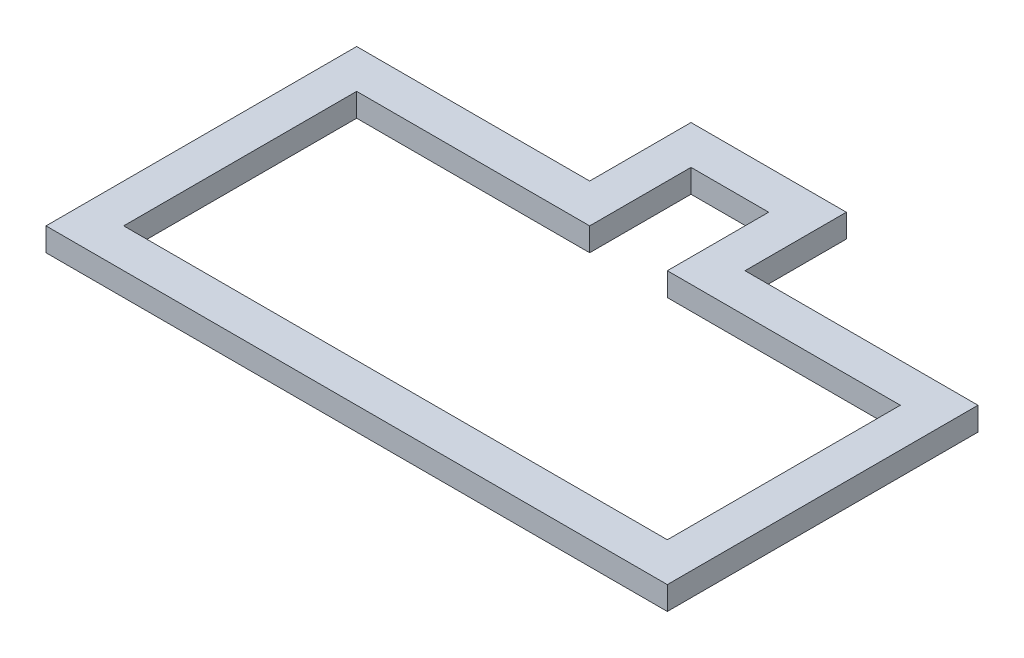
ISO-10303-21;
HEADER;
FILE_DESCRIPTION(('STEP AP214'),'2;1');
FILE_NAME('part.step','',(''),(''),'','','');
FILE_SCHEMA(('AUTOMOTIVE_DESIGN { 1 0 10303 214 1 1 1 1 }'));
ENDSEC;
DATA;
#1=APPLICATION_CONTEXT('core data for automotive mechanical design processes');
#2=APPLICATION_PROTOCOL_DEFINITION('international standard','automotive_design',2000,#1);
#3=PRODUCT_CONTEXT('',#1,'mechanical');
#4=PRODUCT('Part','Part','',(#3));
#5=PRODUCT_RELATED_PRODUCT_CATEGORY('part','',(#4));
#6=PRODUCT_DEFINITION_FORMATION('','',#4);
#7=PRODUCT_DEFINITION_CONTEXT('part definition',#1,'design');
#8=PRODUCT_DEFINITION('design','',#6,#7);
#9=PRODUCT_DEFINITION_SHAPE('','',#8);
#10=(LENGTH_UNIT() NAMED_UNIT(*) SI_UNIT(.MILLI.,.METRE.));
#11=(NAMED_UNIT(*) PLANE_ANGLE_UNIT() SI_UNIT($,.RADIAN.));
#12=(NAMED_UNIT(*) SI_UNIT($,.STERADIAN.) SOLID_ANGLE_UNIT());
#13=UNCERTAINTY_MEASURE_WITH_UNIT(LENGTH_MEASURE(1.E-05),#10,'distance_accuracy_value','');
#14=(GEOMETRIC_REPRESENTATION_CONTEXT(3) GLOBAL_UNCERTAINTY_ASSIGNED_CONTEXT((#13)) GLOBAL_UNIT_ASSIGNED_CONTEXT((#10,
#11,#12)) REPRESENTATION_CONTEXT('',''));
#15=CARTESIAN_POINT('',(0.,0.,0.));
#16=DIRECTION('',(0.,0.,1.));
#17=DIRECTION('',(1.,0.,0.));
#18=AXIS2_PLACEMENT_3D('',#15,#16,#17);
#19=CARTESIAN_POINT('',(0.,30.,-243.948122896738));
#20=DIRECTION('',(0.,0.,-1.));
#21=DIRECTION('',(-1.,0.,0.));
#22=AXIS2_PLACEMENT_3D('',#19,#20,#21);
#23=PLANE('',#22);
#24=DIRECTION('',(1.,0.,0.));
#25=VECTOR('',#24,1.);
#26=CARTESIAN_POINT('',(0.,0.,-243.948122896738));
#27=LINE('',#26,#25);
#28=CARTESIAN_POINT('',(-49.8116760828626,0.,-243.948122896738));
#29=VERTEX_POINT('',#28);
#30=CARTESIAN_POINT('',(50.1883239171374,0.,-243.948122896738));
#31=VERTEX_POINT('',#30);
#32=EDGE_CURVE('E208',#29,#31,#27,.T.);
#33=ORIENTED_EDGE('',*,*,#32,.T.);
#34=DIRECTION('',(0.,-1.,0.));
#35=VECTOR('',#34,1.);
#36=CARTESIAN_POINT('',(50.1883239171374,30.,-243.948122896738));
#37=LINE('',#36,#35);
#38=CARTESIAN_POINT('',(50.1883239171374,30.,-243.948122896738));
#39=VERTEX_POINT('',#38);
#40=EDGE_CURVE('E11',#39,#31,#37,.T.);
#41=ORIENTED_EDGE('',*,*,#40,.F.);
#42=DIRECTION('',(1.,0.,0.));
#43=VECTOR('',#42,1.);
#44=CARTESIAN_POINT('',(0.,30.,-243.948122896738));
#45=LINE('',#44,#43);
#46=CARTESIAN_POINT('',(-49.8116760828626,30.,-243.948122896738));
#47=VERTEX_POINT('',#46);
#48=EDGE_CURVE('E287',#47,#39,#45,.T.);
#49=ORIENTED_EDGE('',*,*,#48,.F.);
#50=DIRECTION('',(0.,-1.,0.));
#51=VECTOR('',#50,1.);
#52=CARTESIAN_POINT('',(-49.8116760828626,30.,-243.948122896738));
#53=LINE('',#52,#51);
#54=EDGE_CURVE('E54',#47,#29,#53,.T.);
#55=ORIENTED_EDGE('',*,*,#54,.T.);
#56=EDGE_LOOP('',(#33,#41,#49,#55));
#57=FACE_BOUND('',#56,.T.);
#58=ADVANCED_FACE('F35',(#57),#23,.F.);
#59=CARTESIAN_POINT('',(50.1883239171375,30.,0.));
#60=DIRECTION('',(1.,0.,0.));
#61=DIRECTION('',(0.,0.,-1.));
#62=AXIS2_PLACEMENT_3D('',#59,#60,#61);
#63=PLANE('',#62);
#64=DIRECTION('',(0.,0.,1.));
#65=VECTOR('',#64,1.);
#66=CARTESIAN_POINT('',(50.1883239171375,0.,0.));
#67=LINE('',#66,#65);
#68=CARTESIAN_POINT('',(50.1883239171374,0.,-113.46516007533));
#69=VERTEX_POINT('',#68);
#70=EDGE_CURVE('E210',#31,#69,#67,.T.);
#71=ORIENTED_EDGE('',*,*,#70,.T.);
#72=DIRECTION('',(0.,-1.,0.));
#73=VECTOR('',#72,1.);
#74=CARTESIAN_POINT('',(50.1883239171374,30.,-113.46516007533));
#75=LINE('',#74,#73);
#76=CARTESIAN_POINT('',(50.1883239171374,30.,-113.46516007533));
#77=VERTEX_POINT('',#76);
#78=EDGE_CURVE('E45',#77,#69,#75,.T.);
#79=ORIENTED_EDGE('',*,*,#78,.F.);
#80=DIRECTION('',(0.,0.,1.));
#81=VECTOR('',#80,1.);
#82=CARTESIAN_POINT('',(50.1883239171375,30.,0.));
#83=LINE('',#82,#81);
#84=EDGE_CURVE('E289',#39,#77,#83,.T.);
#85=ORIENTED_EDGE('',*,*,#84,.F.);
#86=ORIENTED_EDGE('',*,*,#40,.T.);
#87=EDGE_LOOP('',(#71,#79,#85,#86));
#88=FACE_BOUND('',#87,.T.);
#89=ADVANCED_FACE('F315',(#88),#63,.F.);
#90=CARTESIAN_POINT('',(0.,30.,-113.46516007533));
#91=DIRECTION('',(0.,0.,-1.));
#92=DIRECTION('',(-1.,0.,0.));
#93=AXIS2_PLACEMENT_3D('',#90,#91,#92);
#94=PLANE('',#93);
#95=DIRECTION('',(1.,0.,0.));
#96=VECTOR('',#95,1.);
#97=CARTESIAN_POINT('',(0.,0.,-113.46516007533));
#98=LINE('',#97,#96);
#99=CARTESIAN_POINT('',(350.188323917137,0.,-113.46516007533));
#100=VERTEX_POINT('',#99);
#101=EDGE_CURVE('E212',#69,#100,#98,.T.);
#102=ORIENTED_EDGE('',*,*,#101,.T.);
#103=DIRECTION('',(0.,-1.,0.));
#104=VECTOR('',#103,1.);
#105=CARTESIAN_POINT('',(350.188323917137,30.,-113.46516007533));
#106=LINE('',#105,#104);
#107=CARTESIAN_POINT('',(350.188323917137,30.,-113.46516007533));
#108=VERTEX_POINT('',#107);
#109=EDGE_CURVE('E231',#108,#100,#106,.T.);
#110=ORIENTED_EDGE('',*,*,#109,.F.);
#111=DIRECTION('',(1.,0.,0.));
#112=VECTOR('',#111,1.);
#113=CARTESIAN_POINT('',(0.,30.,-113.46516007533));
#114=LINE('',#113,#112);
#115=EDGE_CURVE('E174',#77,#108,#114,.T.);
#116=ORIENTED_EDGE('',*,*,#115,.F.);
#117=ORIENTED_EDGE('',*,*,#78,.T.);
#118=EDGE_LOOP('',(#102,#110,#116,#117));
#119=FACE_BOUND('',#118,.T.);
#120=ADVANCED_FACE('F320',(#119),#94,.F.);
#121=CARTESIAN_POINT('',(350.188323917137,30.,0.));
#122=DIRECTION('',(1.,0.,0.));
#123=DIRECTION('',(0.,0.,-1.));
#124=AXIS2_PLACEMENT_3D('',#121,#122,#123);
#125=PLANE('',#124);
#126=DIRECTION('',(0.,0.,1.));
#127=VECTOR('',#126,1.);
#128=CARTESIAN_POINT('',(350.188323917137,0.,0.));
#129=LINE('',#128,#127);
#130=CARTESIAN_POINT('',(350.188323917137,0.,186.53483992467));
#131=VERTEX_POINT('',#130);
#132=EDGE_CURVE('E214',#100,#131,#129,.T.);
#133=ORIENTED_EDGE('',*,*,#132,.T.);
#134=DIRECTION('',(0.,-1.,0.));
#135=VECTOR('',#134,1.);
#136=CARTESIAN_POINT('',(350.188323917137,30.,186.53483992467));
#137=LINE('',#136,#135);
#138=CARTESIAN_POINT('',(350.188323917137,30.,186.53483992467));
#139=VERTEX_POINT('',#138);
#140=EDGE_CURVE('E229',#139,#131,#137,.T.);
#141=ORIENTED_EDGE('',*,*,#140,.F.);
#142=DIRECTION('',(0.,0.,1.));
#143=VECTOR('',#142,1.);
#144=CARTESIAN_POINT('',(350.188323917137,30.,0.));
#145=LINE('',#144,#143);
#146=EDGE_CURVE('E181',#108,#139,#145,.T.);
#147=ORIENTED_EDGE('',*,*,#146,.F.);
#148=ORIENTED_EDGE('',*,*,#109,.T.);
#149=EDGE_LOOP('',(#133,#141,#147,#148));
#150=FACE_BOUND('',#149,.T.);
#151=ADVANCED_FACE('F295',(#150),#125,.F.);
#152=CARTESIAN_POINT('',(0.,30.,186.53483992467));
#153=DIRECTION('',(0.,0.,-1.));
#154=DIRECTION('',(-1.,0.,0.));
#155=AXIS2_PLACEMENT_3D('',#152,#153,#154);
#156=PLANE('',#155);
#157=DIRECTION('',(1.,0.,0.));
#158=VECTOR('',#157,1.);
#159=CARTESIAN_POINT('',(0.,0.,186.53483992467));
#160=LINE('',#159,#158);
#161=CARTESIAN_POINT('',(-349.811676082863,0.,186.53483992467));
#162=VERTEX_POINT('',#161);
#163=EDGE_CURVE('E218',#162,#131,#160,.T.);
#164=ORIENTED_EDGE('',*,*,#163,.F.);
#165=DIRECTION('',(0.,-1.,0.));
#166=VECTOR('',#165,1.);
#167=CARTESIAN_POINT('',(-349.811676082863,30.,186.53483992467));
#168=LINE('',#167,#166);
#169=CARTESIAN_POINT('',(-349.811676082863,30.,186.53483992467));
#170=VERTEX_POINT('',#169);
#171=EDGE_CURVE('E166',#170,#162,#168,.T.);
#172=ORIENTED_EDGE('',*,*,#171,.F.);
#173=DIRECTION('',(1.,0.,0.));
#174=VECTOR('',#173,1.);
#175=CARTESIAN_POINT('',(0.,30.,186.53483992467));
#176=LINE('',#175,#174);
#177=EDGE_CURVE('E179',#170,#139,#176,.T.);
#178=ORIENTED_EDGE('',*,*,#177,.T.);
#179=ORIENTED_EDGE('',*,*,#140,.T.);
#180=EDGE_LOOP('',(#164,#172,#178,#179));
#181=FACE_BOUND('',#180,.T.);
#182=ADVANCED_FACE('F299',(#181),#156,.T.);
#183=CARTESIAN_POINT('',(-349.811676082863,30.,0.));
#184=DIRECTION('',(1.,0.,0.));
#185=DIRECTION('',(0.,0.,-1.));
#186=AXIS2_PLACEMENT_3D('',#183,#184,#185);
#187=PLANE('',#186);
#188=DIRECTION('',(0.,0.,1.));
#189=VECTOR('',#188,1.);
#190=CARTESIAN_POINT('',(-349.811676082863,0.,0.));
#191=LINE('',#190,#189);
#192=CARTESIAN_POINT('',(-349.811676082863,0.,-113.46516007533));
#193=VERTEX_POINT('',#192);
#194=EDGE_CURVE('E163',#193,#162,#191,.T.);
#195=ORIENTED_EDGE('',*,*,#194,.F.);
#196=DIRECTION('',(0.,-1.,0.));
#197=VECTOR('',#196,1.);
#198=CARTESIAN_POINT('',(-349.811676082863,30.,-113.46516007533));
#199=LINE('',#198,#197);
#200=CARTESIAN_POINT('',(-349.811676082863,30.,-113.46516007533));
#201=VERTEX_POINT('',#200);
#202=EDGE_CURVE('E157',#201,#193,#199,.T.);
#203=ORIENTED_EDGE('',*,*,#202,.F.);
#204=DIRECTION('',(0.,0.,1.));
#205=VECTOR('',#204,1.);
#206=CARTESIAN_POINT('',(-349.811676082863,30.,0.));
#207=LINE('',#206,#205);
#208=EDGE_CURVE('E161',#201,#170,#207,.T.);
#209=ORIENTED_EDGE('',*,*,#208,.T.);
#210=ORIENTED_EDGE('',*,*,#171,.T.);
#211=EDGE_LOOP('',(#195,#203,#209,#210));
#212=FACE_BOUND('',#211,.T.);
#213=ADVANCED_FACE('F159',(#212),#187,.T.);
#214=CARTESIAN_POINT('',(-49.8116760828626,0.,-113.46516007533));
#215=VERTEX_POINT('',#214);
#216=EDGE_CURVE('E215',#193,#215,#98,.T.);
#217=ORIENTED_EDGE('',*,*,#216,.T.);
#218=DIRECTION('',(0.,-1.,0.));
#219=VECTOR('',#218,1.);
#220=CARTESIAN_POINT('',(-49.8116760828626,30.,-113.46516007533));
#221=LINE('',#220,#219);
#222=CARTESIAN_POINT('',(-49.8116760828626,30.,-113.46516007533));
#223=VERTEX_POINT('',#222);
#224=EDGE_CURVE('E105',#223,#215,#221,.T.);
#225=ORIENTED_EDGE('',*,*,#224,.F.);
#226=EDGE_CURVE('E168',#201,#223,#114,.T.);
#227=ORIENTED_EDGE('',*,*,#226,.F.);
#228=ORIENTED_EDGE('',*,*,#202,.T.);
#229=EDGE_LOOP('',(#217,#225,#227,#228));
#230=FACE_BOUND('',#229,.T.);
#231=ADVANCED_FACE('F169',(#230),#94,.F.);
#232=CARTESIAN_POINT('',(0.,30.,-163.46516007533));
#233=DIRECTION('',(0.,0.,-1.));
#234=DIRECTION('',(-1.,0.,0.));
#235=AXIS2_PLACEMENT_3D('',#232,#233,#234);
#236=PLANE('',#235);
#237=DIRECTION('',(1.,0.,0.));
#238=VECTOR('',#237,1.);
#239=CARTESIAN_POINT('',(0.,0.,-163.46516007533));
#240=LINE('',#239,#238);
#241=CARTESIAN_POINT('',(100.188323917137,0.,-163.46516007533));
#242=VERTEX_POINT('',#241);
#243=CARTESIAN_POINT('',(400.188323917137,0.,-163.46516007533));
#244=VERTEX_POINT('',#243);
#245=EDGE_CURVE('E187',#242,#244,#240,.T.);
#246=ORIENTED_EDGE('',*,*,#245,.F.);
#247=DIRECTION('',(0.,-1.,0.));
#248=VECTOR('',#247,1.);
#249=CARTESIAN_POINT('',(100.188323917137,30.,-163.46516007533));
#250=LINE('',#249,#248);
#251=CARTESIAN_POINT('',(100.188323917137,30.,-163.46516007533));
#252=VERTEX_POINT('',#251);
#253=EDGE_CURVE('E39',#252,#242,#250,.T.);
#254=ORIENTED_EDGE('',*,*,#253,.F.);
#255=DIRECTION('',(1.,0.,0.));
#256=VECTOR('',#255,1.);
#257=CARTESIAN_POINT('',(0.,30.,-163.46516007533));
#258=LINE('',#257,#256);
#259=CARTESIAN_POINT('',(400.188323917137,30.,-163.46516007533));
#260=VERTEX_POINT('',#259);
#261=EDGE_CURVE('E225',#252,#260,#258,.T.);
#262=ORIENTED_EDGE('',*,*,#261,.T.);
#263=DIRECTION('',(0.,-1.,0.));
#264=VECTOR('',#263,1.);
#265=CARTESIAN_POINT('',(400.188323917137,30.,-163.46516007533));
#266=LINE('',#265,#264);
#267=EDGE_CURVE('E186',#260,#244,#266,.T.);
#268=ORIENTED_EDGE('',*,*,#267,.T.);
#269=EDGE_LOOP('',(#246,#254,#262,#268));
#270=FACE_BOUND('',#269,.T.);
#271=ADVANCED_FACE('F256',(#270),#236,.T.);
#272=CARTESIAN_POINT('',(100.188323917137,30.,0.));
#273=DIRECTION('',(1.,0.,0.));
#274=DIRECTION('',(0.,0.,-1.));
#275=AXIS2_PLACEMENT_3D('',#272,#273,#274);
#276=PLANE('',#275);
#277=DIRECTION('',(0.,0.,1.));
#278=VECTOR('',#277,1.);
#279=CARTESIAN_POINT('',(100.188323917137,0.,0.));
#280=LINE('',#279,#278);
#281=CARTESIAN_POINT('',(100.188323917137,0.,-293.948122896738));
#282=VERTEX_POINT('',#281);
#283=EDGE_CURVE('E190',#282,#242,#280,.T.);
#284=ORIENTED_EDGE('',*,*,#283,.F.);
#285=DIRECTION('',(0.,-1.,0.));
#286=VECTOR('',#285,1.);
#287=CARTESIAN_POINT('',(100.188323917137,30.,-293.948122896738));
#288=LINE('',#287,#286);
#289=CARTESIAN_POINT('',(100.188323917137,30.,-293.948122896738));
#290=VERTEX_POINT('',#289);
#291=EDGE_CURVE('E247',#290,#282,#288,.T.);
#292=ORIENTED_EDGE('',*,*,#291,.F.);
#293=DIRECTION('',(0.,0.,1.));
#294=VECTOR('',#293,1.);
#295=CARTESIAN_POINT('',(100.188323917137,30.,0.));
#296=LINE('',#295,#294);
#297=EDGE_CURVE('E255',#290,#252,#296,.T.);
#298=ORIENTED_EDGE('',*,*,#297,.T.);
#299=ORIENTED_EDGE('',*,*,#253,.T.);
#300=EDGE_LOOP('',(#284,#292,#298,#299));
#301=FACE_BOUND('',#300,.T.);
#302=ADVANCED_FACE('F37',(#301),#276,.T.);
#303=CARTESIAN_POINT('',(0.,30.,-293.948122896738));
#304=DIRECTION('',(0.,0.,-1.));
#305=DIRECTION('',(-1.,0.,0.));
#306=AXIS2_PLACEMENT_3D('',#303,#304,#305);
#307=PLANE('',#306);
#308=DIRECTION('',(1.,0.,0.));
#309=VECTOR('',#308,1.);
#310=CARTESIAN_POINT('',(0.,0.,-293.948122896738));
#311=LINE('',#310,#309);
#312=CARTESIAN_POINT('',(-99.8116760828626,0.,-293.948122896738));
#313=VERTEX_POINT('',#312);
#314=EDGE_CURVE('E194',#313,#282,#311,.T.);
#315=ORIENTED_EDGE('',*,*,#314,.F.);
#316=DIRECTION('',(0.,-1.,0.));
#317=VECTOR('',#316,1.);
#318=CARTESIAN_POINT('',(-99.8116760828626,30.,-293.948122896738));
#319=LINE('',#318,#317);
#320=CARTESIAN_POINT('',(-99.8116760828626,30.,-293.948122896738));
#321=VERTEX_POINT('',#320);
#322=EDGE_CURVE('E246',#321,#313,#319,.T.);
#323=ORIENTED_EDGE('',*,*,#322,.F.);
#324=DIRECTION('',(1.,0.,0.));
#325=VECTOR('',#324,1.);
#326=CARTESIAN_POINT('',(0.,30.,-293.948122896738));
#327=LINE('',#326,#325);
#328=EDGE_CURVE('E266',#321,#290,#327,.T.);
#329=ORIENTED_EDGE('',*,*,#328,.T.);
#330=ORIENTED_EDGE('',*,*,#291,.T.);
#331=EDGE_LOOP('',(#315,#323,#329,#330));
#332=FACE_BOUND('',#331,.T.);
#333=ADVANCED_FACE('F263',(#332),#307,.T.);
#334=CARTESIAN_POINT('',(-99.8116760828626,30.,0.));
#335=DIRECTION('',(1.,0.,0.));
#336=DIRECTION('',(0.,0.,-1.));
#337=AXIS2_PLACEMENT_3D('',#334,#335,#336);
#338=PLANE('',#337);
#339=DIRECTION('',(0.,0.,1.));
#340=VECTOR('',#339,1.);
#341=CARTESIAN_POINT('',(-99.8116760828626,0.,0.));
#342=LINE('',#341,#340);
#343=CARTESIAN_POINT('',(-99.8116760828626,0.,-163.46516007533));
#344=VERTEX_POINT('',#343);
#345=EDGE_CURVE('E197',#313,#344,#342,.T.);
#346=ORIENTED_EDGE('',*,*,#345,.T.);
#347=DIRECTION('',(0.,-1.,0.));
#348=VECTOR('',#347,1.);
#349=CARTESIAN_POINT('',(-99.8116760828626,30.,-163.46516007533));
#350=LINE('',#349,#348);
#351=CARTESIAN_POINT('',(-99.8116760828626,30.,-163.46516007533));
#352=VERTEX_POINT('',#351);
#353=EDGE_CURVE('E244',#352,#344,#350,.T.);
#354=ORIENTED_EDGE('',*,*,#353,.F.);
#355=DIRECTION('',(0.,0.,1.));
#356=VECTOR('',#355,1.);
#357=CARTESIAN_POINT('',(-99.8116760828626,30.,0.));
#358=LINE('',#357,#356);
#359=EDGE_CURVE('E269',#321,#352,#358,.T.);
#360=ORIENTED_EDGE('',*,*,#359,.F.);
#361=ORIENTED_EDGE('',*,*,#322,.T.);
#362=EDGE_LOOP('',(#346,#354,#360,#361));
#363=FACE_BOUND('',#362,.T.);
#364=ADVANCED_FACE('F270',(#363),#338,.F.);
#365=CARTESIAN_POINT('',(-399.811676082863,0.,-163.46516007533));
#366=VERTEX_POINT('',#365);
#367=EDGE_CURVE('E191',#366,#344,#240,.T.);
#368=ORIENTED_EDGE('',*,*,#367,.F.);
#369=DIRECTION('',(0.,-1.,0.));
#370=VECTOR('',#369,1.);
#371=CARTESIAN_POINT('',(-399.811676082863,30.,-163.46516007533));
#372=LINE('',#371,#370);
#373=CARTESIAN_POINT('',(-399.811676082863,30.,-163.46516007533));
#374=VERTEX_POINT('',#373);
#375=EDGE_CURVE('E242',#374,#366,#372,.T.);
#376=ORIENTED_EDGE('',*,*,#375,.F.);
#377=EDGE_CURVE('E274',#374,#352,#258,.T.);
#378=ORIENTED_EDGE('',*,*,#377,.T.);
#379=ORIENTED_EDGE('',*,*,#353,.T.);
#380=EDGE_LOOP('',(#368,#376,#378,#379));
#381=FACE_BOUND('',#380,.T.);
#382=ADVANCED_FACE('F331',(#381),#236,.T.);
#383=CARTESIAN_POINT('',(-399.811676082863,30.,1.10970032075292E-13));
#384=DIRECTION('',(1.,0.,0.));
#385=DIRECTION('',(0.,0.,-1.));
#386=AXIS2_PLACEMENT_3D('',#383,#384,#385);
#387=PLANE('',#386);
#388=DIRECTION('',(0.,0.,1.));
#389=VECTOR('',#388,1.);
#390=CARTESIAN_POINT('',(-399.811676082863,0.,1.10970032075292E-13));
#391=LINE('',#390,#389);
#392=CARTESIAN_POINT('',(-399.811676082863,0.,236.53483992467));
#393=VERTEX_POINT('',#392);
#394=EDGE_CURVE('E200',#366,#393,#391,.T.);
#395=ORIENTED_EDGE('',*,*,#394,.T.);
#396=DIRECTION('',(0.,-1.,0.));
#397=VECTOR('',#396,1.);
#398=CARTESIAN_POINT('',(-399.811676082863,30.,236.53483992467));
#399=LINE('',#398,#397);
#400=CARTESIAN_POINT('',(-399.811676082863,30.,236.53483992467));
#401=VERTEX_POINT('',#400);
#402=EDGE_CURVE('E239',#401,#393,#399,.T.);
#403=ORIENTED_EDGE('',*,*,#402,.F.);
#404=DIRECTION('',(0.,0.,1.));
#405=VECTOR('',#404,1.);
#406=CARTESIAN_POINT('',(-399.811676082863,30.,1.10970032075292E-13));
#407=LINE('',#406,#405);
#408=EDGE_CURVE('E280',#374,#401,#407,.T.);
#409=ORIENTED_EDGE('',*,*,#408,.F.);
#410=ORIENTED_EDGE('',*,*,#375,.T.);
#411=EDGE_LOOP('',(#395,#403,#409,#410));
#412=FACE_BOUND('',#411,.T.);
#413=ADVANCED_FACE('F327',(#412),#387,.F.);
#414=CARTESIAN_POINT('',(0.,30.,236.53483992467));
#415=DIRECTION('',(0.,0.,-1.));
#416=DIRECTION('',(-1.,0.,0.));
#417=AXIS2_PLACEMENT_3D('',#414,#415,#416);
#418=PLANE('',#417);
#419=DIRECTION('',(1.,0.,0.));
#420=VECTOR('',#419,1.);
#421=CARTESIAN_POINT('',(0.,0.,236.53483992467));
#422=LINE('',#421,#420);
#423=CARTESIAN_POINT('',(400.188323917137,0.,236.53483992467));
#424=VERTEX_POINT('',#423);
#425=EDGE_CURVE('E202',#393,#424,#422,.T.);
#426=ORIENTED_EDGE('',*,*,#425,.T.);
#427=DIRECTION('',(0.,-1.,0.));
#428=VECTOR('',#427,1.);
#429=CARTESIAN_POINT('',(400.188323917137,30.,236.53483992467));
#430=LINE('',#429,#428);
#431=CARTESIAN_POINT('',(400.188323917137,30.,236.53483992467));
#432=VERTEX_POINT('',#431);
#433=EDGE_CURVE('E237',#432,#424,#430,.T.);
#434=ORIENTED_EDGE('',*,*,#433,.F.);
#435=DIRECTION('',(1.,0.,0.));
#436=VECTOR('',#435,1.);
#437=CARTESIAN_POINT('',(0.,30.,236.53483992467));
#438=LINE('',#437,#436);
#439=EDGE_CURVE('E282',#401,#432,#438,.T.);
#440=ORIENTED_EDGE('',*,*,#439,.F.);
#441=ORIENTED_EDGE('',*,*,#402,.T.);
#442=EDGE_LOOP('',(#426,#434,#440,#441));
#443=FACE_BOUND('',#442,.T.);
#444=ADVANCED_FACE('F309',(#443),#418,.F.);
#445=CARTESIAN_POINT('',(400.188323917137,30.,0.));
#446=DIRECTION('',(1.,0.,0.));
#447=DIRECTION('',(0.,0.,-1.));
#448=AXIS2_PLACEMENT_3D('',#445,#446,#447);
#449=PLANE('',#448);
#450=DIRECTION('',(0.,0.,1.));
#451=VECTOR('',#450,1.);
#452=CARTESIAN_POINT('',(400.188323917137,0.,0.));
#453=LINE('',#452,#451);
#454=EDGE_CURVE('E205',#244,#424,#453,.T.);
#455=ORIENTED_EDGE('',*,*,#454,.F.);
#456=ORIENTED_EDGE('',*,*,#267,.F.);
#457=DIRECTION('',(0.,0.,1.));
#458=VECTOR('',#457,1.);
#459=CARTESIAN_POINT('',(400.188323917137,30.,0.));
#460=LINE('',#459,#458);
#461=EDGE_CURVE('E284',#260,#432,#460,.T.);
#462=ORIENTED_EDGE('',*,*,#461,.T.);
#463=ORIENTED_EDGE('',*,*,#433,.T.);
#464=EDGE_LOOP('',(#455,#456,#462,#463));
#465=FACE_BOUND('',#464,.T.);
#466=ADVANCED_FACE('F302',(#465),#449,.T.);
#467=CARTESIAN_POINT('',(-49.8116760828625,30.,0.));
#468=DIRECTION('',(1.,0.,0.));
#469=DIRECTION('',(0.,0.,-1.));
#470=AXIS2_PLACEMENT_3D('',#467,#468,#469);
#471=PLANE('',#470);
#472=DIRECTION('',(0.,0.,1.));
#473=VECTOR('',#472,1.);
#474=CARTESIAN_POINT('',(-49.8116760828625,0.,0.));
#475=LINE('',#474,#473);
#476=EDGE_CURVE('E222',#29,#215,#475,.T.);
#477=ORIENTED_EDGE('',*,*,#476,.F.);
#478=ORIENTED_EDGE('',*,*,#54,.F.);
#479=DIRECTION('',(0.,0.,1.));
#480=VECTOR('',#479,1.);
#481=CARTESIAN_POINT('',(-49.8116760828625,30.,0.));
#482=LINE('',#481,#480);
#483=EDGE_CURVE('E172',#47,#223,#482,.T.);
#484=ORIENTED_EDGE('',*,*,#483,.T.);
#485=ORIENTED_EDGE('',*,*,#224,.T.);
#486=EDGE_LOOP('',(#477,#478,#484,#485));
#487=FACE_BOUND('',#486,.T.);
#488=ADVANCED_FACE('F300',(#487),#471,.T.);
#489=CARTESIAN_POINT('',(0.,30.,0.));
#490=DIRECTION('',(0.,1.,0.));
#491=DIRECTION('',(0.,0.,1.));
#492=AXIS2_PLACEMENT_3D('',#489,#490,#491);
#493=PLANE('',#492);
#494=ORIENTED_EDGE('',*,*,#261,.F.);
#495=ORIENTED_EDGE('',*,*,#297,.F.);
#496=ORIENTED_EDGE('',*,*,#328,.F.);
#497=ORIENTED_EDGE('',*,*,#359,.T.);
#498=ORIENTED_EDGE('',*,*,#377,.F.);
#499=ORIENTED_EDGE('',*,*,#408,.T.);
#500=ORIENTED_EDGE('',*,*,#439,.T.);
#501=ORIENTED_EDGE('',*,*,#461,.F.);
#502=EDGE_LOOP('',(#494,#495,#496,#497,#498,#499,#500,#501));
#503=FACE_BOUND('',#502,.T.);
#504=ORIENTED_EDGE('',*,*,#48,.T.);
#505=ORIENTED_EDGE('',*,*,#84,.T.);
#506=ORIENTED_EDGE('',*,*,#115,.T.);
#507=ORIENTED_EDGE('',*,*,#146,.T.);
#508=ORIENTED_EDGE('',*,*,#177,.F.);
#509=ORIENTED_EDGE('',*,*,#208,.F.);
#510=ORIENTED_EDGE('',*,*,#226,.T.);
#511=ORIENTED_EDGE('',*,*,#483,.F.);
#512=EDGE_LOOP('',(#504,#505,#506,#507,#508,#509,#510,#511));
#513=FACE_BOUND('',#512,.T.);
#514=ADVANCED_FACE('F177',(#503,#513),#493,.T.);
#515=CARTESIAN_POINT('',(0.,0.,0.));
#516=DIRECTION('',(0.,1.,0.));
#517=DIRECTION('',(0.,0.,1.));
#518=AXIS2_PLACEMENT_3D('',#515,#516,#517);
#519=PLANE('',#518);
#520=ORIENTED_EDGE('',*,*,#245,.T.);
#521=ORIENTED_EDGE('',*,*,#454,.T.);
#522=ORIENTED_EDGE('',*,*,#425,.F.);
#523=ORIENTED_EDGE('',*,*,#394,.F.);
#524=ORIENTED_EDGE('',*,*,#367,.T.);
#525=ORIENTED_EDGE('',*,*,#345,.F.);
#526=ORIENTED_EDGE('',*,*,#314,.T.);
#527=ORIENTED_EDGE('',*,*,#283,.T.);
#528=EDGE_LOOP('',(#520,#521,#522,#523,#524,#525,#526,#527));
#529=FACE_BOUND('',#528,.T.);
#530=ORIENTED_EDGE('',*,*,#32,.F.);
#531=ORIENTED_EDGE('',*,*,#476,.T.);
#532=ORIENTED_EDGE('',*,*,#216,.F.);
#533=ORIENTED_EDGE('',*,*,#194,.T.);
#534=ORIENTED_EDGE('',*,*,#163,.T.);
#535=ORIENTED_EDGE('',*,*,#132,.F.);
#536=ORIENTED_EDGE('',*,*,#101,.F.);
#537=ORIENTED_EDGE('',*,*,#70,.F.);
#538=EDGE_LOOP('',(#530,#531,#532,#533,#534,#535,#536,#537));
#539=FACE_BOUND('',#538,.T.);
#540=ADVANCED_FACE('F259',(#529,#539),#519,.F.);
#541=CLOSED_SHELL('',(#58,#89,#120,#151,#182,#213,#231,#271,#302,#333,#364,#382,#413,#444,#466,
#488,#514,#540));
#542=MANIFOLD_SOLID_BREP('B2',#541);
#543=ADVANCED_BREP_SHAPE_REPRESENTATION('',(#18,#542),#14);
#544=SHAPE_DEFINITION_REPRESENTATION(#9,#543);
ENDSEC;
END-ISO-10303-21;
